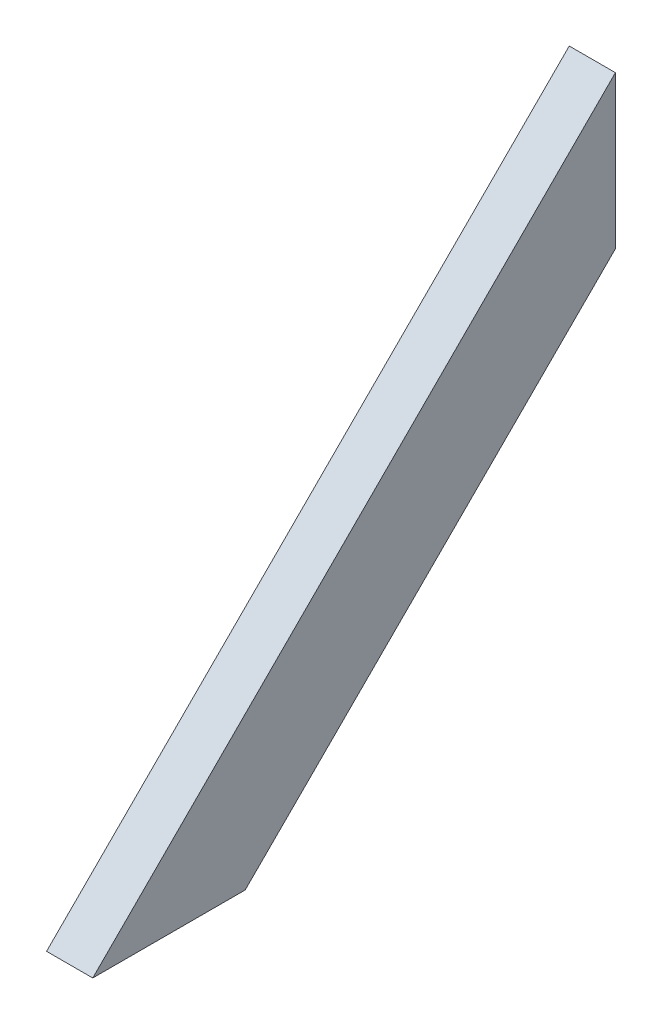
ISO-10303-21;
HEADER;
FILE_DESCRIPTION(('STEP AP214'),'2;1');
FILE_NAME('part.step','',(''),(''),'','','');
FILE_SCHEMA(('AUTOMOTIVE_DESIGN { 1 0 10303 214 1 1 1 1 }'));
ENDSEC;
DATA;
#1=APPLICATION_CONTEXT('core data for automotive mechanical design processes');
#2=APPLICATION_PROTOCOL_DEFINITION('international standard','automotive_design',2000,#1);
#3=PRODUCT_CONTEXT('',#1,'mechanical');
#4=PRODUCT('Part','Part','',(#3));
#5=PRODUCT_RELATED_PRODUCT_CATEGORY('part','',(#4));
#6=PRODUCT_DEFINITION_FORMATION('','',#4);
#7=PRODUCT_DEFINITION_CONTEXT('part definition',#1,'design');
#8=PRODUCT_DEFINITION('design','',#6,#7);
#9=PRODUCT_DEFINITION_SHAPE('','',#8);
#10=(LENGTH_UNIT() NAMED_UNIT(*) SI_UNIT(.MILLI.,.METRE.));
#11=(NAMED_UNIT(*) PLANE_ANGLE_UNIT() SI_UNIT($,.RADIAN.));
#12=(NAMED_UNIT(*) SI_UNIT($,.STERADIAN.) SOLID_ANGLE_UNIT());
#13=UNCERTAINTY_MEASURE_WITH_UNIT(LENGTH_MEASURE(1.E-05),#10,'distance_accuracy_value','');
#14=(GEOMETRIC_REPRESENTATION_CONTEXT(3) GLOBAL_UNCERTAINTY_ASSIGNED_CONTEXT((#13)) GLOBAL_UNIT_ASSIGNED_CONTEXT((#10,
#11,#12)) REPRESENTATION_CONTEXT('',''));
#15=CARTESIAN_POINT('',(0.,0.,0.));
#16=DIRECTION('',(0.,0.,1.));
#17=DIRECTION('',(1.,0.,0.));
#18=AXIS2_PLACEMENT_3D('',#15,#16,#17);
#19=CARTESIAN_POINT('',(38.1,431.052293811319,-431.052293811319));
#20=DIRECTION('',(0.,-0.707106781186547,-0.707106781186547));
#21=DIRECTION('',(0.,0.707106781186548,-0.707106781186548));
#22=AXIS2_PLACEMENT_3D('',#19,#20,#21);
#23=PLANE('',#22);
#24=DIRECTION('',(0.,-0.707106781186547,0.707106781186547));
#25=VECTOR('',#24,1.);
#26=CARTESIAN_POINT('',(0.,431.052293811319,-431.052293811319));
#27=LINE('',#26,#25);
#28=CARTESIAN_POINT('',(0.,431.052293811319,-431.052293811319));
#29=VERTEX_POINT('',#28);
#30=CARTESIAN_POINT('',(0.,0.,0.));
#31=VERTEX_POINT('',#30);
#32=EDGE_CURVE('E96',#29,#31,#27,.T.);
#33=ORIENTED_EDGE('',*,*,#32,.T.);
#34=DIRECTION('',(-1.,0.,0.));
#35=VECTOR('',#34,1.);
#36=CARTESIAN_POINT('',(38.1,0.,0.));
#37=LINE('',#36,#35);
#38=CARTESIAN_POINT('',(38.1,0.,0.));
#39=VERTEX_POINT('',#38);
#40=EDGE_CURVE('E11',#39,#31,#37,.T.);
#41=ORIENTED_EDGE('',*,*,#40,.F.);
#42=DIRECTION('',(0.,-0.707106781186547,0.707106781186547));
#43=VECTOR('',#42,1.);
#44=CARTESIAN_POINT('',(38.1,431.052293811319,-431.052293811319));
#45=LINE('',#44,#43);
#46=CARTESIAN_POINT('',(38.1,431.052293811319,-431.052293811319));
#47=VERTEX_POINT('',#46);
#48=EDGE_CURVE('E84',#47,#39,#45,.T.);
#49=ORIENTED_EDGE('',*,*,#48,.F.);
#50=DIRECTION('',(-1.,0.,0.));
#51=VECTOR('',#50,1.);
#52=CARTESIAN_POINT('',(38.1,431.052293811319,-431.052293811319));
#53=LINE('',#52,#51);
#54=EDGE_CURVE('E92',#47,#29,#53,.T.);
#55=ORIENTED_EDGE('',*,*,#54,.T.);
#56=EDGE_LOOP('',(#33,#41,#49,#55));
#57=FACE_BOUND('',#56,.T.);
#58=ADVANCED_FACE('F33',(#57),#23,.F.);
#59=CARTESIAN_POINT('',(38.1,0.,0.));
#60=DIRECTION('',(0.,1.,0.));
#61=DIRECTION('',(0.,0.,1.));
#62=AXIS2_PLACEMENT_3D('',#59,#60,#61);
#63=PLANE('',#62);
#64=DIRECTION('',(0.,0.,-1.));
#65=VECTOR('',#64,1.);
#66=CARTESIAN_POINT('',(0.,0.,0.));
#67=LINE('',#66,#65);
#68=CARTESIAN_POINT('',(0.,0.,-125.723585694968));
#69=VERTEX_POINT('',#68);
#70=EDGE_CURVE('E88',#31,#69,#67,.T.);
#71=ORIENTED_EDGE('',*,*,#70,.T.);
#72=DIRECTION('',(-1.,0.,0.));
#73=VECTOR('',#72,1.);
#74=CARTESIAN_POINT('',(38.1,0.,-125.723585694968));
#75=LINE('',#74,#73);
#76=CARTESIAN_POINT('',(38.1,0.,-125.723585694968));
#77=VERTEX_POINT('',#76);
#78=EDGE_CURVE('E41',#77,#69,#75,.T.);
#79=ORIENTED_EDGE('',*,*,#78,.F.);
#80=DIRECTION('',(0.,0.,-1.));
#81=VECTOR('',#80,1.);
#82=CARTESIAN_POINT('',(38.1,0.,0.));
#83=LINE('',#82,#81);
#84=EDGE_CURVE('E79',#39,#77,#83,.T.);
#85=ORIENTED_EDGE('',*,*,#84,.F.);
#86=ORIENTED_EDGE('',*,*,#40,.T.);
#87=EDGE_LOOP('',(#71,#79,#85,#86));
#88=FACE_BOUND('',#87,.T.);
#89=ADVANCED_FACE('F87',(#88),#63,.F.);
#90=CARTESIAN_POINT('',(38.1,0.,-125.723585694968));
#91=DIRECTION('',(0.,0.707106781186547,0.707106781186548));
#92=DIRECTION('',(0.,-0.707106781186548,0.707106781186547));
#93=AXIS2_PLACEMENT_3D('',#90,#91,#92);
#94=PLANE('',#93);
#95=DIRECTION('',(0.,0.707106781186548,-0.707106781186547));
#96=VECTOR('',#95,1.);
#97=CARTESIAN_POINT('',(0.,0.,-125.723585694968));
#98=LINE('',#97,#96);
#99=CARTESIAN_POINT('',(0.,305.328708116351,-431.052293811319));
#100=VERTEX_POINT('',#99);
#101=EDGE_CURVE('E66',#69,#100,#98,.T.);
#102=ORIENTED_EDGE('',*,*,#101,.T.);
#103=DIRECTION('',(-1.,0.,0.));
#104=VECTOR('',#103,1.);
#105=CARTESIAN_POINT('',(38.1,305.328708116351,-431.052293811319));
#106=LINE('',#105,#104);
#107=CARTESIAN_POINT('',(38.1,305.328708116351,-431.052293811319));
#108=VERTEX_POINT('',#107);
#109=EDGE_CURVE('E89',#108,#100,#106,.T.);
#110=ORIENTED_EDGE('',*,*,#109,.F.);
#111=DIRECTION('',(0.,0.707106781186548,-0.707106781186547));
#112=VECTOR('',#111,1.);
#113=CARTESIAN_POINT('',(38.1,0.,-125.723585694968));
#114=LINE('',#113,#112);
#115=EDGE_CURVE('E82',#77,#108,#114,.T.);
#116=ORIENTED_EDGE('',*,*,#115,.F.);
#117=ORIENTED_EDGE('',*,*,#78,.T.);
#118=EDGE_LOOP('',(#102,#110,#116,#117));
#119=FACE_BOUND('',#118,.T.);
#120=ADVANCED_FACE('F90',(#119),#94,.F.);
#121=CARTESIAN_POINT('',(38.1,305.328708116351,-431.052293811319));
#122=DIRECTION('',(0.,0.,1.));
#123=DIRECTION('',(1.,0.,0.));
#124=AXIS2_PLACEMENT_3D('',#121,#122,#123);
#125=PLANE('',#124);
#126=DIRECTION('',(0.,1.,0.));
#127=VECTOR('',#126,1.);
#128=CARTESIAN_POINT('',(0.,305.328708116351,-431.052293811319));
#129=LINE('',#128,#127);
#130=EDGE_CURVE('E72',#100,#29,#129,.T.);
#131=ORIENTED_EDGE('',*,*,#130,.T.);
#132=ORIENTED_EDGE('',*,*,#54,.F.);
#133=DIRECTION('',(0.,1.,0.));
#134=VECTOR('',#133,1.);
#135=CARTESIAN_POINT('',(38.1,305.328708116351,-431.052293811319));
#136=LINE('',#135,#134);
#137=EDGE_CURVE('E49',#108,#47,#136,.T.);
#138=ORIENTED_EDGE('',*,*,#137,.F.);
#139=ORIENTED_EDGE('',*,*,#109,.T.);
#140=EDGE_LOOP('',(#131,#132,#138,#139));
#141=FACE_BOUND('',#140,.T.);
#142=ADVANCED_FACE('F103',(#141),#125,.F.);
#143=CARTESIAN_POINT('',(38.1,0.,0.));
#144=DIRECTION('',(1.,0.,0.));
#145=DIRECTION('',(0.,0.,-1.));
#146=AXIS2_PLACEMENT_3D('',#143,#144,#145);
#147=PLANE('',#146);
#148=ORIENTED_EDGE('',*,*,#48,.T.);
#149=ORIENTED_EDGE('',*,*,#84,.T.);
#150=ORIENTED_EDGE('',*,*,#115,.T.);
#151=ORIENTED_EDGE('',*,*,#137,.T.);
#152=EDGE_LOOP('',(#148,#149,#150,#151));
#153=FACE_BOUND('',#152,.T.);
#154=ADVANCED_FACE('F80',(#153),#147,.T.);
#155=CARTESIAN_POINT('',(0.,0.,0.));
#156=DIRECTION('',(1.,0.,0.));
#157=DIRECTION('',(0.,0.,-1.));
#158=AXIS2_PLACEMENT_3D('',#155,#156,#157);
#159=PLANE('',#158);
#160=ORIENTED_EDGE('',*,*,#32,.F.);
#161=ORIENTED_EDGE('',*,*,#130,.F.);
#162=ORIENTED_EDGE('',*,*,#101,.F.);
#163=ORIENTED_EDGE('',*,*,#70,.F.);
#164=EDGE_LOOP('',(#160,#161,#162,#163));
#165=FACE_BOUND('',#164,.T.);
#166=ADVANCED_FACE('F106',(#165),#159,.F.);
#167=CLOSED_SHELL('',(#58,#89,#120,#142,#154,#166));
#168=MANIFOLD_SOLID_BREP('B2',#167);
#169=ADVANCED_BREP_SHAPE_REPRESENTATION('',(#18,#168),#14);
#170=SHAPE_DEFINITION_REPRESENTATION(#9,#169);
ENDSEC;
END-ISO-10303-21;
